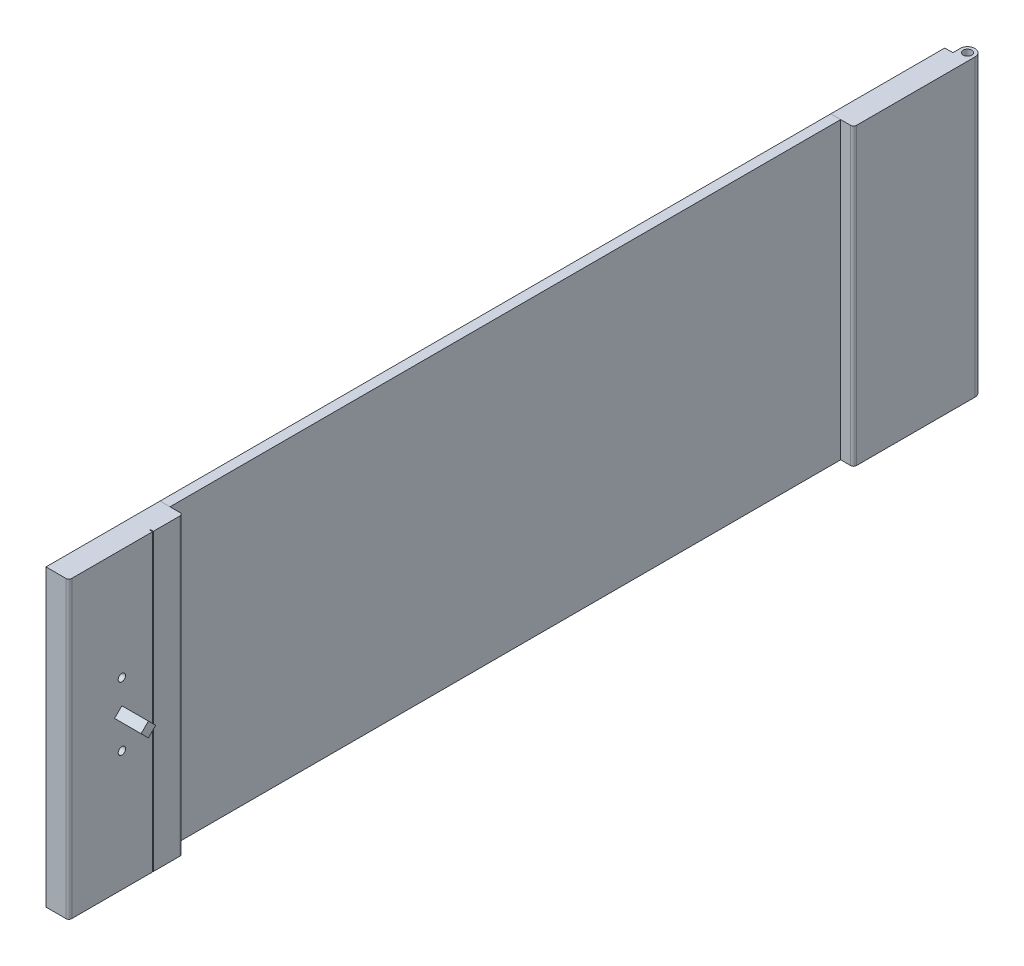
ISO-10303-21;
HEADER;
FILE_DESCRIPTION(('STEP AP214'),'2;1');
FILE_NAME('part.step','',(''),(''),'','','');
FILE_SCHEMA(('AUTOMOTIVE_DESIGN { 1 0 10303 214 1 1 1 1 }'));
ENDSEC;
DATA;
#1=APPLICATION_CONTEXT('core data for automotive mechanical design processes');
#2=APPLICATION_PROTOCOL_DEFINITION('international standard','automotive_design',2000,#1);
#3=PRODUCT_CONTEXT('',#1,'mechanical');
#4=PRODUCT('Part','Part','',(#3));
#5=PRODUCT_RELATED_PRODUCT_CATEGORY('part','',(#4));
#6=PRODUCT_DEFINITION_FORMATION('','',#4);
#7=PRODUCT_DEFINITION_CONTEXT('part definition',#1,'design');
#8=PRODUCT_DEFINITION('design','',#6,#7);
#9=PRODUCT_DEFINITION_SHAPE('','',#8);
#10=(LENGTH_UNIT() NAMED_UNIT(*) SI_UNIT(.MILLI.,.METRE.));
#11=(NAMED_UNIT(*) PLANE_ANGLE_UNIT() SI_UNIT($,.RADIAN.));
#12=(NAMED_UNIT(*) SI_UNIT($,.STERADIAN.) SOLID_ANGLE_UNIT());
#13=UNCERTAINTY_MEASURE_WITH_UNIT(LENGTH_MEASURE(1.E-05),#10,'distance_accuracy_value','');
#14=(GEOMETRIC_REPRESENTATION_CONTEXT(3) GLOBAL_UNCERTAINTY_ASSIGNED_CONTEXT((#13)) GLOBAL_UNIT_ASSIGNED_CONTEXT((#10,
#11,#12)) REPRESENTATION_CONTEXT('',''));
#15=CARTESIAN_POINT('',(0.,0.,0.));
#16=DIRECTION('',(0.,0.,1.));
#17=DIRECTION('',(1.,0.,0.));
#18=AXIS2_PLACEMENT_3D('',#15,#16,#17);
#19=CARTESIAN_POINT('',(134.032480032175,0.,346.351902973472));
#20=DIRECTION('',(-1.,0.,0.));
#21=DIRECTION('',(0.,0.,1.));
#22=AXIS2_PLACEMENT_3D('',#19,#20,#21);
#23=PLANE('',#22);
#24=DIRECTION('',(0.,0.,1.));
#25=VECTOR('',#24,1.);
#26=CARTESIAN_POINT('',(134.032480032175,200.,346.351902973472));
#27=LINE('',#26,#25);
#28=CARTESIAN_POINT('',(134.032480032175,200.,-108.848097026528));
#29=VERTEX_POINT('',#28);
#30=CARTESIAN_POINT('',(134.032480032175,200.,346.351902973472));
#31=VERTEX_POINT('',#30);
#32=EDGE_CURVE('E113',#29,#31,#27,.T.);
#33=ORIENTED_EDGE('',*,*,#32,.F.);
#34=DIRECTION('',(0.,1.,0.));
#35=VECTOR('',#34,1.);
#36=CARTESIAN_POINT('',(134.032480032175,0.,-108.848097026528));
#37=LINE('',#36,#35);
#38=CARTESIAN_POINT('',(134.032480032175,0.,-108.848097026528));
#39=VERTEX_POINT('',#38);
#40=EDGE_CURVE('E12',#39,#29,#37,.T.);
#41=ORIENTED_EDGE('',*,*,#40,.F.);
#42=DIRECTION('',(0.,0.,1.));
#43=VECTOR('',#42,1.);
#44=CARTESIAN_POINT('',(134.032480032175,0.,346.351902973472));
#45=LINE('',#44,#43);
#46=CARTESIAN_POINT('',(134.032480032175,0.,346.351902973472));
#47=VERTEX_POINT('',#46);
#48=EDGE_CURVE('E107',#39,#47,#45,.T.);
#49=ORIENTED_EDGE('',*,*,#48,.T.);
#50=DIRECTION('',(0.,1.,0.));
#51=VECTOR('',#50,1.);
#52=CARTESIAN_POINT('',(134.032480032175,0.,346.351902973472));
#53=LINE('',#52,#51);
#54=EDGE_CURVE('E52',#47,#31,#53,.T.);
#55=ORIENTED_EDGE('',*,*,#54,.T.);
#56=EDGE_LOOP('',(#33,#41,#49,#55));
#57=FACE_BOUND('',#56,.T.);
#58=ADVANCED_FACE('F49',(#57),#23,.T.);
#59=CARTESIAN_POINT('',(134.032480032175,0.,-108.848097026528));
#60=DIRECTION('',(0.,0.,-1.));
#61=DIRECTION('',(-1.,0.,0.));
#62=AXIS2_PLACEMENT_3D('',#59,#60,#61);
#63=PLANE('',#62);
#64=DIRECTION('',(-1.,0.,0.));
#65=VECTOR('',#64,1.);
#66=CARTESIAN_POINT('',(134.032480032175,200.,-108.848097026528));
#67=LINE('',#66,#65);
#68=CARTESIAN_POINT('',(140.782480032175,200.,-108.848097026528));
#69=VERTEX_POINT('',#68);
#70=EDGE_CURVE('E109',#69,#29,#67,.T.);
#71=ORIENTED_EDGE('',*,*,#70,.F.);
#72=DIRECTION('',(0.,1.,0.));
#73=VECTOR('',#72,1.);
#74=CARTESIAN_POINT('',(140.782480032175,0.,-108.848097026528));
#75=LINE('',#74,#73);
#76=CARTESIAN_POINT('',(140.782480032175,0.,-108.848097026528));
#77=VERTEX_POINT('',#76);
#78=EDGE_CURVE('E58',#77,#69,#75,.T.);
#79=ORIENTED_EDGE('',*,*,#78,.F.);
#80=DIRECTION('',(-1.,0.,0.));
#81=VECTOR('',#80,1.);
#82=CARTESIAN_POINT('',(134.032480032175,0.,-108.848097026528));
#83=LINE('',#82,#81);
#84=EDGE_CURVE('E104',#77,#39,#83,.T.);
#85=ORIENTED_EDGE('',*,*,#84,.T.);
#86=ORIENTED_EDGE('',*,*,#40,.T.);
#87=EDGE_LOOP('',(#71,#79,#85,#86));
#88=FACE_BOUND('',#87,.T.);
#89=ADVANCED_FACE('F123',(#88),#63,.T.);
#90=CARTESIAN_POINT('',(140.782480032175,0.,346.351902973472));
#91=DIRECTION('',(1.,0.,0.));
#92=DIRECTION('',(0.,0.,-1.));
#93=AXIS2_PLACEMENT_3D('',#90,#91,#92);
#94=PLANE('',#93);
#95=DIRECTION('',(0.,0.,-1.));
#96=VECTOR('',#95,1.);
#97=CARTESIAN_POINT('',(140.782480032175,200.,346.351902973472));
#98=LINE('',#97,#96);
#99=CARTESIAN_POINT('',(140.782480032175,200.,346.351902973472));
#100=VERTEX_POINT('',#99);
#101=EDGE_CURVE('E99',#100,#69,#98,.T.);
#102=ORIENTED_EDGE('',*,*,#101,.F.);
#103=DIRECTION('',(0.,1.,0.));
#104=VECTOR('',#103,1.);
#105=CARTESIAN_POINT('',(140.782480032175,0.,346.351902973472));
#106=LINE('',#105,#104);
#107=CARTESIAN_POINT('',(140.782480032175,0.,346.351902973472));
#108=VERTEX_POINT('',#107);
#109=EDGE_CURVE('E94',#108,#100,#106,.T.);
#110=ORIENTED_EDGE('',*,*,#109,.F.);
#111=DIRECTION('',(0.,0.,-1.));
#112=VECTOR('',#111,1.);
#113=CARTESIAN_POINT('',(140.782480032175,0.,346.351902973472));
#114=LINE('',#113,#112);
#115=EDGE_CURVE('E97',#108,#77,#114,.T.);
#116=ORIENTED_EDGE('',*,*,#115,.T.);
#117=ORIENTED_EDGE('',*,*,#78,.T.);
#118=EDGE_LOOP('',(#102,#110,#116,#117));
#119=FACE_BOUND('',#118,.T.);
#120=ADVANCED_FACE('F96',(#119),#94,.T.);
#121=CARTESIAN_POINT('',(134.032480032175,0.,346.351902973472));
#122=DIRECTION('',(0.,0.,1.));
#123=DIRECTION('',(1.,0.,0.));
#124=AXIS2_PLACEMENT_3D('',#121,#122,#123);
#125=PLANE('',#124);
#126=DIRECTION('',(1.,0.,0.));
#127=VECTOR('',#126,1.);
#128=CARTESIAN_POINT('',(134.032480032175,200.,346.351902973472));
#129=LINE('',#128,#127);
#130=EDGE_CURVE('E116',#31,#100,#129,.T.);
#131=ORIENTED_EDGE('',*,*,#130,.F.);
#132=ORIENTED_EDGE('',*,*,#54,.F.);
#133=DIRECTION('',(1.,0.,0.));
#134=VECTOR('',#133,1.);
#135=CARTESIAN_POINT('',(134.032480032175,0.,346.351902973472));
#136=LINE('',#135,#134);
#137=EDGE_CURVE('E103',#47,#108,#136,.T.);
#138=ORIENTED_EDGE('',*,*,#137,.T.);
#139=ORIENTED_EDGE('',*,*,#109,.T.);
#140=EDGE_LOOP('',(#131,#132,#138,#139));
#141=FACE_BOUND('',#140,.T.);
#142=ADVANCED_FACE('F106',(#141),#125,.T.);
#143=CARTESIAN_POINT('',(0.,0.,0.));
#144=DIRECTION('',(0.,-1.,0.));
#145=DIRECTION('',(0.,0.,-1.));
#146=AXIS2_PLACEMENT_3D('',#143,#144,#145);
#147=PLANE('',#146);
#148=ORIENTED_EDGE('',*,*,#48,.F.);
#149=ORIENTED_EDGE('',*,*,#84,.F.);
#150=ORIENTED_EDGE('',*,*,#115,.F.);
#151=ORIENTED_EDGE('',*,*,#137,.F.);
#152=EDGE_LOOP('',(#148,#149,#150,#151));
#153=FACE_BOUND('',#152,.T.);
#154=ADVANCED_FACE('F102',(#153),#147,.T.);
#155=CARTESIAN_POINT('',(0.,200.,0.));
#156=DIRECTION('',(0.,-1.,0.));
#157=DIRECTION('',(0.,0.,-1.));
#158=AXIS2_PLACEMENT_3D('',#155,#156,#157);
#159=PLANE('',#158);
#160=ORIENTED_EDGE('',*,*,#32,.T.);
#161=ORIENTED_EDGE('',*,*,#130,.T.);
#162=ORIENTED_EDGE('',*,*,#101,.T.);
#163=ORIENTED_EDGE('',*,*,#70,.T.);
#164=EDGE_LOOP('',(#160,#161,#162,#163));
#165=FACE_BOUND('',#164,.T.);
#166=ADVANCED_FACE('F122',(#165),#159,.F.);
#167=CLOSED_SHELL('',(#58,#89,#120,#142,#154,#166));
#168=MANIFOLD_SOLID_BREP('B2',#167);
#169=CARTESIAN_POINT('',(144.532480032175,200.,-191.248097026528));
#170=DIRECTION('',(0.,1.,0.));
#171=DIRECTION('',(0.,0.,1.));
#172=AXIS2_PLACEMENT_3D('',#169,#170,#171);
#173=PLANE('',#172);
#174=DIRECTION('',(0.,0.,1.));
#175=VECTOR('',#174,1.);
#176=CARTESIAN_POINT('',(134.032480032175,200.,-108.848097026528));
#177=LINE('',#176,#175);
#178=CARTESIAN_POINT('',(134.032480032175,200.,-186.248097026528));
#179=VERTEX_POINT('',#178);
#180=CARTESIAN_POINT('',(134.032480032175,200.,-108.848097026528));
#181=VERTEX_POINT('',#180);
#182=EDGE_CURVE('E286',#179,#181,#177,.T.);
#183=ORIENTED_EDGE('',*,*,#182,.T.);
#184=DIRECTION('',(1.,0.,0.));
#185=VECTOR('',#184,1.);
#186=CARTESIAN_POINT('',(134.032480032175,200.,-108.848097026528));
#187=LINE('',#186,#185);
#188=CARTESIAN_POINT('',(147.532480032175,200.,-108.848097026528));
#189=VERTEX_POINT('',#188);
#190=EDGE_CURVE('E238',#181,#189,#187,.T.);
#191=ORIENTED_EDGE('',*,*,#190,.T.);
#192=CARTESIAN_POINT('',(147.532480032175,200.,-110.848097026528));
#193=DIRECTION('',(0.,1.,0.));
#194=DIRECTION('',(0.,0.,1.));
#195=AXIS2_PLACEMENT_3D('',#192,#193,#194);
#196=CIRCLE('',#195,2.);
#197=CARTESIAN_POINT('',(149.532480032175,200.,-110.848097026528));
#198=VERTEX_POINT('',#197);
#199=EDGE_CURVE('E298',#189,#198,#196,.T.);
#200=ORIENTED_EDGE('',*,*,#199,.T.);
#201=DIRECTION('',(0.,0.,-1.));
#202=VECTOR('',#201,1.);
#203=CARTESIAN_POINT('',(149.532480032175,200.,-110.848097026528));
#204=LINE('',#203,#202);
#205=CARTESIAN_POINT('',(149.532480032175,200.,-191.248097026528));
#206=VERTEX_POINT('',#205);
#207=EDGE_CURVE('E254',#198,#206,#204,.T.);
#208=ORIENTED_EDGE('',*,*,#207,.T.);
#209=CARTESIAN_POINT('',(144.532480032175,200.,-191.248097026528));
#210=DIRECTION('',(0.,1.,0.));
#211=DIRECTION('',(0.,0.,1.));
#212=AXIS2_PLACEMENT_3D('',#209,#210,#211);
#213=CIRCLE('',#212,5.00000000000003);
#214=CARTESIAN_POINT('',(139.532480032175,200.,-191.248097026528));
#215=VERTEX_POINT('',#214);
#216=EDGE_CURVE('E248',#206,#215,#213,.T.);
#217=ORIENTED_EDGE('',*,*,#216,.T.);
#218=DIRECTION('',(0.,0.,1.));
#219=VECTOR('',#218,1.);
#220=CARTESIAN_POINT('',(139.532480032175,200.,-191.248097026528));
#221=LINE('',#220,#219);
#222=CARTESIAN_POINT('',(139.532480032175,200.,-186.248097026528));
#223=VERTEX_POINT('',#222);
#224=EDGE_CURVE('E252',#215,#223,#221,.T.);
#225=ORIENTED_EDGE('',*,*,#224,.T.);
#226=DIRECTION('',(-1.,0.,0.));
#227=VECTOR('',#226,1.);
#228=CARTESIAN_POINT('',(134.032480032175,200.,-186.248097026528));
#229=LINE('',#228,#227);
#230=EDGE_CURVE('E198',#223,#179,#229,.T.);
#231=ORIENTED_EDGE('',*,*,#230,.T.);
#232=EDGE_LOOP('',(#183,#191,#200,#208,#217,#225,#231));
#233=FACE_BOUND('',#232,.T.);
#234=CARTESIAN_POINT('',(144.532480032175,200.,-191.248097026528));
#235=DIRECTION('',(0.,1.,0.));
#236=DIRECTION('',(0.,0.,1.));
#237=AXIS2_PLACEMENT_3D('',#234,#235,#236);
#238=CIRCLE('',#237,2.93194055291801);
#239=CARTESIAN_POINT('',(144.532480032175,200.,-188.31615647361));
#240=VERTEX_POINT('',#239);
#241=EDGE_CURVE('E276',#240,#240,#238,.T.);
#242=ORIENTED_EDGE('',*,*,#241,.F.);
#243=EDGE_LOOP('',(#242));
#244=FACE_BOUND('',#243,.T.);
#245=ADVANCED_FACE('F181',(#233,#244),#173,.T.);
#246=CARTESIAN_POINT('',(144.532480032175,0.,-191.248097026528));
#247=DIRECTION('',(0.,1.,0.));
#248=DIRECTION('',(0.,0.,1.));
#249=AXIS2_PLACEMENT_3D('',#246,#247,#248);
#250=PLANE('',#249);
#251=DIRECTION('',(0.,0.,1.));
#252=VECTOR('',#251,1.);
#253=CARTESIAN_POINT('',(134.032480032175,0.,-108.848097026528));
#254=LINE('',#253,#252);
#255=CARTESIAN_POINT('',(134.032480032175,0.,-186.248097026528));
#256=VERTEX_POINT('',#255);
#257=CARTESIAN_POINT('',(134.032480032175,0.,-108.848097026528));
#258=VERTEX_POINT('',#257);
#259=EDGE_CURVE('E272',#256,#258,#254,.T.);
#260=ORIENTED_EDGE('',*,*,#259,.F.);
#261=DIRECTION('',(-1.,0.,0.));
#262=VECTOR('',#261,1.);
#263=CARTESIAN_POINT('',(134.032480032175,0.,-186.248097026528));
#264=LINE('',#263,#262);
#265=CARTESIAN_POINT('',(139.532480032175,0.,-186.248097026528));
#266=VERTEX_POINT('',#265);
#267=EDGE_CURVE('E230',#266,#256,#264,.T.);
#268=ORIENTED_EDGE('',*,*,#267,.F.);
#269=DIRECTION('',(0.,0.,1.));
#270=VECTOR('',#269,1.);
#271=CARTESIAN_POINT('',(139.532480032175,0.,-191.248097026528));
#272=LINE('',#271,#270);
#273=CARTESIAN_POINT('',(139.532480032175,0.,-191.248097026528));
#274=VERTEX_POINT('',#273);
#275=EDGE_CURVE('E224',#274,#266,#272,.T.);
#276=ORIENTED_EDGE('',*,*,#275,.F.);
#277=CARTESIAN_POINT('',(144.532480032175,0.,-191.248097026528));
#278=DIRECTION('',(0.,1.,0.));
#279=DIRECTION('',(0.,0.,1.));
#280=AXIS2_PLACEMENT_3D('',#277,#278,#279);
#281=CIRCLE('',#280,5.00000000000003);
#282=CARTESIAN_POINT('',(149.532480032175,0.,-191.248097026528));
#283=VERTEX_POINT('',#282);
#284=EDGE_CURVE('E262',#283,#274,#281,.T.);
#285=ORIENTED_EDGE('',*,*,#284,.F.);
#286=DIRECTION('',(0.,0.,-1.));
#287=VECTOR('',#286,1.);
#288=CARTESIAN_POINT('',(149.532480032175,0.,-191.248097026528));
#289=LINE('',#288,#287);
#290=CARTESIAN_POINT('',(149.532480032175,0.,-110.848097026528));
#291=VERTEX_POINT('',#290);
#292=EDGE_CURVE('E281',#291,#283,#289,.T.);
#293=ORIENTED_EDGE('',*,*,#292,.F.);
#294=CARTESIAN_POINT('',(147.532480032175,0.,-110.848097026528));
#295=DIRECTION('',(0.,1.,0.));
#296=DIRECTION('',(0.,0.,1.));
#297=AXIS2_PLACEMENT_3D('',#294,#295,#296);
#298=CIRCLE('',#297,2.);
#299=CARTESIAN_POINT('',(147.532480032175,0.,-108.848097026528));
#300=VERTEX_POINT('',#299);
#301=EDGE_CURVE('E278',#300,#291,#298,.T.);
#302=ORIENTED_EDGE('',*,*,#301,.F.);
#303=DIRECTION('',(1.,0.,0.));
#304=VECTOR('',#303,1.);
#305=CARTESIAN_POINT('',(134.032480032175,0.,-108.848097026528));
#306=LINE('',#305,#304);
#307=EDGE_CURVE('E275',#258,#300,#306,.T.);
#308=ORIENTED_EDGE('',*,*,#307,.F.);
#309=EDGE_LOOP('',(#260,#268,#276,#285,#293,#302,#308));
#310=FACE_BOUND('',#309,.T.);
#311=CARTESIAN_POINT('',(144.532480032175,0.,-191.248097026528));
#312=DIRECTION('',(0.,1.,0.));
#313=DIRECTION('',(0.,0.,1.));
#314=AXIS2_PLACEMENT_3D('',#311,#312,#313);
#315=CIRCLE('',#314,2.93194055291801);
#316=CARTESIAN_POINT('',(144.532480032175,0.,-188.31615647361));
#317=VERTEX_POINT('',#316);
#318=EDGE_CURVE('E309',#317,#317,#315,.T.);
#319=ORIENTED_EDGE('',*,*,#318,.T.);
#320=EDGE_LOOP('',(#319));
#321=FACE_BOUND('',#320,.T.);
#322=ADVANCED_FACE('F301',(#310,#321),#250,.F.);
#323=CARTESIAN_POINT('',(134.032480032175,200.,-108.848097026528));
#324=DIRECTION('',(1.,0.,0.));
#325=DIRECTION('',(0.,0.,-1.));
#326=AXIS2_PLACEMENT_3D('',#323,#324,#325);
#327=PLANE('',#326);
#328=ORIENTED_EDGE('',*,*,#259,.T.);
#329=DIRECTION('',(0.,-1.,0.));
#330=VECTOR('',#329,1.);
#331=CARTESIAN_POINT('',(134.032480032175,200.,-108.848097026528));
#332=LINE('',#331,#330);
#333=EDGE_CURVE('E47',#181,#258,#332,.T.);
#334=ORIENTED_EDGE('',*,*,#333,.F.);
#335=ORIENTED_EDGE('',*,*,#182,.F.);
#336=DIRECTION('',(0.,-1.,0.));
#337=VECTOR('',#336,1.);
#338=CARTESIAN_POINT('',(134.032480032175,200.,-186.248097026528));
#339=LINE('',#338,#337);
#340=EDGE_CURVE('E268',#179,#256,#339,.T.);
#341=ORIENTED_EDGE('',*,*,#340,.T.);
#342=EDGE_LOOP('',(#328,#334,#335,#341));
#343=FACE_BOUND('',#342,.T.);
#344=ADVANCED_FACE('F183',(#343),#327,.F.);
#345=CARTESIAN_POINT('',(134.032480032175,200.,-108.848097026528));
#346=DIRECTION('',(0.,0.,-1.));
#347=DIRECTION('',(-1.,0.,0.));
#348=AXIS2_PLACEMENT_3D('',#345,#346,#347);
#349=PLANE('',#348);
#350=ORIENTED_EDGE('',*,*,#307,.T.);
#351=DIRECTION('',(0.,-1.,0.));
#352=VECTOR('',#351,1.);
#353=CARTESIAN_POINT('',(147.532480032175,200.,-108.848097026528));
#354=LINE('',#353,#352);
#355=EDGE_CURVE('E190',#189,#300,#354,.T.);
#356=ORIENTED_EDGE('',*,*,#355,.F.);
#357=ORIENTED_EDGE('',*,*,#190,.F.);
#358=ORIENTED_EDGE('',*,*,#333,.T.);
#359=EDGE_LOOP('',(#350,#356,#357,#358));
#360=FACE_BOUND('',#359,.T.);
#361=ADVANCED_FACE('F335',(#360),#349,.F.);
#362=CARTESIAN_POINT('',(147.532480032175,200.,-110.848097026528));
#363=DIRECTION('',(0.,-1.,0.));
#364=DIRECTION('',(0.,0.,-1.));
#365=AXIS2_PLACEMENT_3D('',#362,#363,#364);
#366=CYLINDRICAL_SURFACE('',#365,2.);
#367=ORIENTED_EDGE('',*,*,#301,.T.);
#368=DIRECTION('',(0.,-1.,0.));
#369=VECTOR('',#368,1.);
#370=CARTESIAN_POINT('',(149.532480032175,200.,-110.848097026528));
#371=LINE('',#370,#369);
#372=EDGE_CURVE('E290',#198,#291,#371,.T.);
#373=ORIENTED_EDGE('',*,*,#372,.F.);
#374=ORIENTED_EDGE('',*,*,#199,.F.);
#375=ORIENTED_EDGE('',*,*,#355,.T.);
#376=EDGE_LOOP('',(#367,#373,#374,#375));
#377=FACE_BOUND('',#376,.T.);
#378=ADVANCED_FACE('F296',(#377),#366,.T.);
#379=CARTESIAN_POINT('',(149.532480032175,200.,-191.248097026528));
#380=DIRECTION('',(-1.,0.,0.));
#381=DIRECTION('',(0.,0.,1.));
#382=AXIS2_PLACEMENT_3D('',#379,#380,#381);
#383=PLANE('',#382);
#384=ORIENTED_EDGE('',*,*,#292,.T.);
#385=DIRECTION('',(0.,-1.,0.));
#386=VECTOR('',#385,1.);
#387=CARTESIAN_POINT('',(149.532480032175,200.,-191.248097026528));
#388=LINE('',#387,#386);
#389=EDGE_CURVE('E263',#206,#283,#388,.T.);
#390=ORIENTED_EDGE('',*,*,#389,.F.);
#391=ORIENTED_EDGE('',*,*,#207,.F.);
#392=ORIENTED_EDGE('',*,*,#372,.T.);
#393=EDGE_LOOP('',(#384,#390,#391,#392));
#394=FACE_BOUND('',#393,.T.);
#395=ADVANCED_FACE('F304',(#394),#383,.F.);
#396=CARTESIAN_POINT('',(144.532480032175,200.,-191.248097026528));
#397=DIRECTION('',(0.,-1.,0.));
#398=DIRECTION('',(0.,0.,-1.));
#399=AXIS2_PLACEMENT_3D('',#396,#397,#398);
#400=CYLINDRICAL_SURFACE('',#399,5.00000000000003);
#401=ORIENTED_EDGE('',*,*,#284,.T.);
#402=DIRECTION('',(0.,-1.,0.));
#403=VECTOR('',#402,1.);
#404=CARTESIAN_POINT('',(139.532480032175,200.,-191.248097026528));
#405=LINE('',#404,#403);
#406=EDGE_CURVE('E259',#215,#274,#405,.T.);
#407=ORIENTED_EDGE('',*,*,#406,.F.);
#408=ORIENTED_EDGE('',*,*,#216,.F.);
#409=ORIENTED_EDGE('',*,*,#389,.T.);
#410=EDGE_LOOP('',(#401,#407,#408,#409));
#411=FACE_BOUND('',#410,.T.);
#412=ADVANCED_FACE('F260',(#411),#400,.T.);
#413=CARTESIAN_POINT('',(139.532480032175,200.,-191.248097026528));
#414=DIRECTION('',(1.,0.,0.));
#415=DIRECTION('',(0.,0.,-1.));
#416=AXIS2_PLACEMENT_3D('',#413,#414,#415);
#417=PLANE('',#416);
#418=ORIENTED_EDGE('',*,*,#275,.T.);
#419=DIRECTION('',(0.,-1.,0.));
#420=VECTOR('',#419,1.);
#421=CARTESIAN_POINT('',(139.532480032175,200.,-186.248097026528));
#422=LINE('',#421,#420);
#423=EDGE_CURVE('E264',#223,#266,#422,.T.);
#424=ORIENTED_EDGE('',*,*,#423,.F.);
#425=ORIENTED_EDGE('',*,*,#224,.F.);
#426=ORIENTED_EDGE('',*,*,#406,.T.);
#427=EDGE_LOOP('',(#418,#424,#425,#426));
#428=FACE_BOUND('',#427,.T.);
#429=ADVANCED_FACE('F266',(#428),#417,.F.);
#430=CARTESIAN_POINT('',(134.032480032175,200.,-186.248097026528));
#431=DIRECTION('',(0.,0.,1.));
#432=DIRECTION('',(1.,0.,0.));
#433=AXIS2_PLACEMENT_3D('',#430,#431,#432);
#434=PLANE('',#433);
#435=ORIENTED_EDGE('',*,*,#267,.T.);
#436=ORIENTED_EDGE('',*,*,#340,.F.);
#437=ORIENTED_EDGE('',*,*,#230,.F.);
#438=ORIENTED_EDGE('',*,*,#423,.T.);
#439=EDGE_LOOP('',(#435,#436,#437,#438));
#440=FACE_BOUND('',#439,.T.);
#441=ADVANCED_FACE('F325',(#440),#434,.F.);
#442=CARTESIAN_POINT('',(144.532480032175,200.,-191.248097026528));
#443=DIRECTION('',(0.,-1.,0.));
#444=DIRECTION('',(0.,0.,-1.));
#445=AXIS2_PLACEMENT_3D('',#442,#443,#444);
#446=CYLINDRICAL_SURFACE('',#445,2.93194055291801);
#447=ORIENTED_EDGE('',*,*,#241,.T.);
#448=EDGE_LOOP('',(#447));
#449=FACE_BOUND('',#448,.T.);
#450=ORIENTED_EDGE('',*,*,#318,.F.);
#451=EDGE_LOOP('',(#450));
#452=FACE_BOUND('',#451,.T.);
#453=ADVANCED_FACE('F315',(#449,#452),#446,.F.);
#454=CLOSED_SHELL('',(#245,#322,#344,#361,#378,#395,#412,#429,#441,#453));
#455=MANIFOLD_SOLID_BREP('B6',#454);
#456=CARTESIAN_POINT('',(149.532480032175,200.,421.751902973472));
#457=DIRECTION('',(-1.,0.,0.));
#458=DIRECTION('',(0.,0.,1.));
#459=AXIS2_PLACEMENT_3D('',#456,#457,#458);
#460=PLANE('',#459);
#461=DIRECTION('',(0.,0.,-1.));
#462=VECTOR('',#461,1.);
#463=CARTESIAN_POINT('',(149.532480032175,0.,421.751902973472));
#464=LINE('',#463,#462);
#465=CARTESIAN_POINT('',(149.532480032175,0.,421.751902973472));
#466=VERTEX_POINT('',#465);
#467=CARTESIAN_POINT('',(149.532480032175,0.,366.951902973472));
#468=VERTEX_POINT('',#467);
#469=EDGE_CURVE('E576',#466,#468,#464,.T.);
#470=ORIENTED_EDGE('',*,*,#469,.T.);
#471=DIRECTION('',(0.,-1.,0.));
#472=VECTOR('',#471,1.);
#473=CARTESIAN_POINT('',(149.532480032175,200.,366.951902973472));
#474=LINE('',#473,#472);
#475=CARTESIAN_POINT('',(149.532480032175,200.,366.951902973472));
#476=VERTEX_POINT('',#475);
#477=EDGE_CURVE('E606',#476,#468,#474,.T.);
#478=ORIENTED_EDGE('',*,*,#477,.F.);
#479=DIRECTION('',(0.,0.,-1.));
#480=VECTOR('',#479,1.);
#481=CARTESIAN_POINT('',(149.532480032175,200.,421.751902973472));
#482=LINE('',#481,#480);
#483=CARTESIAN_POINT('',(149.532480032175,200.,421.751902973472));
#484=VERTEX_POINT('',#483);
#485=EDGE_CURVE('E555',#484,#476,#482,.T.);
#486=ORIENTED_EDGE('',*,*,#485,.F.);
#487=DIRECTION('',(0.,-1.,0.));
#488=VECTOR('',#487,1.);
#489=CARTESIAN_POINT('',(149.532480032175,200.,421.751902973472));
#490=LINE('',#489,#488);
#491=EDGE_CURVE('E609',#484,#466,#490,.T.);
#492=ORIENTED_EDGE('',*,*,#491,.T.);
#493=EDGE_LOOP('',(#470,#478,#486,#492));
#494=FACE_BOUND('',#493,.T.);
#495=DIRECTION('',(0.,0.707106781186548,-0.707106781186548));
#496=VECTOR('',#495,1.);
#497=CARTESIAN_POINT('',(149.532480032175,247.937135064061,247.937135064061));
#498=LINE('',#497,#496);
#499=CARTESIAN_POINT('',(149.532480032175,103.172619686343,392.701650441778));
#500=VERTEX_POINT('',#499);
#501=CARTESIAN_POINT('',(149.532480032175,108.122367154649,387.751902973472));
#502=VERTEX_POINT('',#501);
#503=EDGE_CURVE('E422',#500,#502,#498,.T.);
#504=ORIENTED_EDGE('',*,*,#503,.T.);
#505=DIRECTION('',(0.,-0.707106781186546,-0.70710678118655));
#506=VECTOR('',#505,1.);
#507=CARTESIAN_POINT('',(149.532480032175,-139.814767909411,139.81476790941));
#508=LINE('',#507,#506);
#509=CARTESIAN_POINT('',(149.532480032175,103.172619686344,382.802155505166));
#510=VERTEX_POINT('',#509);
#511=EDGE_CURVE('E512',#502,#510,#508,.T.);
#512=ORIENTED_EDGE('',*,*,#511,.T.);
#513=DIRECTION('',(0.,0.707106781186548,-0.707106781186548));
#514=VECTOR('',#513,1.);
#515=CARTESIAN_POINT('',(149.532480032175,242.987387595755,242.987387595755));
#516=LINE('',#515,#514);
#517=CARTESIAN_POINT('',(149.532480032175,98.2228722180377,387.751902973472));
#518=VERTEX_POINT('',#517);
#519=EDGE_CURVE('E525',#518,#510,#516,.T.);
#520=ORIENTED_EDGE('',*,*,#519,.F.);
#521=DIRECTION('',(0.,-0.707106781186546,-0.70710678118655));
#522=VECTOR('',#521,1.);
#523=CARTESIAN_POINT('',(149.532480032175,-144.764515377717,144.764515377716));
#524=LINE('',#523,#522);
#525=EDGE_CURVE('E427',#500,#518,#524,.T.);
#526=ORIENTED_EDGE('',*,*,#525,.F.);
#527=EDGE_LOOP('',(#504,#512,#520,#526));
#528=FACE_BOUND('',#527,.T.);
#529=CARTESIAN_POINT('',(149.532480032175,81.6726196863435,387.751902973472));
#530=DIRECTION('',(1.,0.,0.));
#531=DIRECTION('',(0.,0.,-1.));
#532=AXIS2_PLACEMENT_3D('',#529,#530,#531);
#533=CIRCLE('',#532,2.50000000000002);
#534=CARTESIAN_POINT('',(149.532480032175,81.6726196863435,385.251902973472));
#535=VERTEX_POINT('',#534);
#536=EDGE_CURVE('E841',#535,#535,#533,.F.);
#537=ORIENTED_EDGE('',*,*,#536,.T.);
#538=EDGE_LOOP('',(#537));
#539=FACE_BOUND('',#538,.T.);
#540=CARTESIAN_POINT('',(149.532480032175,124.672619686344,387.751902973472));
#541=DIRECTION('',(1.,0.,0.));
#542=DIRECTION('',(0.,0.,-1.));
#543=AXIS2_PLACEMENT_3D('',#540,#541,#542);
#544=CIRCLE('',#543,2.50000000000002);
#545=CARTESIAN_POINT('',(149.532480032175,124.672619686344,385.251902973472));
#546=VERTEX_POINT('',#545);
#547=EDGE_CURVE('E834',#546,#546,#544,.T.);
#548=ORIENTED_EDGE('',*,*,#547,.F.);
#549=EDGE_LOOP('',(#548));
#550=FACE_BOUND('',#549,.T.);
#551=ADVANCED_FACE('F407',(#494,#528,#539,#550),#460,.F.);
#552=CARTESIAN_POINT('',(134.032480032175,200.,423.751902973472));
#553=DIRECTION('',(1.,0.,0.));
#554=DIRECTION('',(0.,0.,-1.));
#555=AXIS2_PLACEMENT_3D('',#552,#553,#554);
#556=PLANE('',#555);
#557=DIRECTION('',(0.,0.,1.));
#558=VECTOR('',#557,1.);
#559=CARTESIAN_POINT('',(134.032480032175,0.,423.751902973472));
#560=LINE('',#559,#558);
#561=CARTESIAN_POINT('',(134.032480032175,0.,346.351902973472));
#562=VERTEX_POINT('',#561);
#563=CARTESIAN_POINT('',(134.032480032175,0.,423.751902973472));
#564=VERTEX_POINT('',#563);
#565=EDGE_CURVE('E515',#562,#564,#560,.T.);
#566=ORIENTED_EDGE('',*,*,#565,.T.);
#567=DIRECTION('',(0.,-1.,0.));
#568=VECTOR('',#567,1.);
#569=CARTESIAN_POINT('',(134.032480032175,200.,423.751902973472));
#570=LINE('',#569,#568);
#571=CARTESIAN_POINT('',(134.032480032175,200.,423.751902973472));
#572=VERTEX_POINT('',#571);
#573=EDGE_CURVE('E179',#572,#564,#570,.T.);
#574=ORIENTED_EDGE('',*,*,#573,.F.);
#575=DIRECTION('',(0.,0.,1.));
#576=VECTOR('',#575,1.);
#577=CARTESIAN_POINT('',(134.032480032175,200.,423.751902973472));
#578=LINE('',#577,#576);
#579=CARTESIAN_POINT('',(134.032480032175,200.,346.351902973472));
#580=VERTEX_POINT('',#579);
#581=EDGE_CURVE('E547',#580,#572,#578,.T.);
#582=ORIENTED_EDGE('',*,*,#581,.F.);
#583=DIRECTION('',(0.,-1.,0.));
#584=VECTOR('',#583,1.);
#585=CARTESIAN_POINT('',(134.032480032175,200.,346.351902973472));
#586=LINE('',#585,#584);
#587=EDGE_CURVE('E569',#580,#562,#586,.T.);
#588=ORIENTED_EDGE('',*,*,#587,.T.);
#589=EDGE_LOOP('',(#566,#574,#582,#588));
#590=FACE_BOUND('',#589,.T.);
#591=ADVANCED_FACE('F409',(#590),#556,.F.);
#592=CARTESIAN_POINT('',(134.032480032175,200.,423.751902973472));
#593=DIRECTION('',(0.,0.,-1.));
#594=DIRECTION('',(-1.,0.,0.));
#595=AXIS2_PLACEMENT_3D('',#592,#593,#594);
#596=PLANE('',#595);
#597=DIRECTION('',(1.,0.,0.));
#598=VECTOR('',#597,1.);
#599=CARTESIAN_POINT('',(134.032480032175,0.,423.751902973472));
#600=LINE('',#599,#598);
#601=CARTESIAN_POINT('',(147.532480032175,0.,423.751902973472));
#602=VERTEX_POINT('',#601);
#603=EDGE_CURVE('E572',#564,#602,#600,.T.);
#604=ORIENTED_EDGE('',*,*,#603,.T.);
#605=DIRECTION('',(0.,-1.,0.));
#606=VECTOR('',#605,1.);
#607=CARTESIAN_POINT('',(147.532480032175,200.,423.751902973472));
#608=LINE('',#607,#606);
#609=CARTESIAN_POINT('',(147.532480032175,200.,423.751902973472));
#610=VERTEX_POINT('',#609);
#611=EDGE_CURVE('E415',#610,#602,#608,.T.);
#612=ORIENTED_EDGE('',*,*,#611,.F.);
#613=DIRECTION('',(1.,0.,0.));
#614=VECTOR('',#613,1.);
#615=CARTESIAN_POINT('',(134.032480032175,200.,423.751902973472));
#616=LINE('',#615,#614);
#617=EDGE_CURVE('E550',#572,#610,#616,.T.);
#618=ORIENTED_EDGE('',*,*,#617,.F.);
#619=ORIENTED_EDGE('',*,*,#573,.T.);
#620=EDGE_LOOP('',(#604,#612,#618,#619));
#621=FACE_BOUND('',#620,.T.);
#622=ADVANCED_FACE('F638',(#621),#596,.F.);
#623=CARTESIAN_POINT('',(147.532480032175,200.,421.751902973472));
#624=DIRECTION('',(0.,-1.,0.));
#625=DIRECTION('',(0.,0.,-1.));
#626=AXIS2_PLACEMENT_3D('',#623,#624,#625);
#627=CYLINDRICAL_SURFACE('',#626,2.);
#628=CARTESIAN_POINT('',(147.532480032175,0.,421.751902973472));
#629=DIRECTION('',(0.,1.,0.));
#630=DIRECTION('',(0.,0.,1.));
#631=AXIS2_PLACEMENT_3D('',#628,#629,#630);
#632=CIRCLE('',#631,2.);
#633=EDGE_CURVE('E574',#602,#466,#632,.T.);
#634=ORIENTED_EDGE('',*,*,#633,.T.);
#635=ORIENTED_EDGE('',*,*,#491,.F.);
#636=CARTESIAN_POINT('',(147.532480032175,200.,421.751902973472));
#637=DIRECTION('',(0.,1.,0.));
#638=DIRECTION('',(0.,0.,1.));
#639=AXIS2_PLACEMENT_3D('',#636,#637,#638);
#640=CIRCLE('',#639,2.);
#641=EDGE_CURVE('E553',#610,#484,#640,.T.);
#642=ORIENTED_EDGE('',*,*,#641,.F.);
#643=ORIENTED_EDGE('',*,*,#611,.T.);
#644=EDGE_LOOP('',(#634,#635,#642,#643));
#645=FACE_BOUND('',#644,.T.);
#646=ADVANCED_FACE('F616',(#645),#627,.T.);
#647=CARTESIAN_POINT('',(149.532480032175,200.,366.951902973472));
#648=DIRECTION('',(0.,0.,1.));
#649=DIRECTION('',(1.,0.,0.));
#650=AXIS2_PLACEMENT_3D('',#647,#648,#649);
#651=PLANE('',#650);
#652=DIRECTION('',(-1.,0.,0.));
#653=VECTOR('',#652,1.);
#654=CARTESIAN_POINT('',(149.532480032175,0.,366.951902973472));
#655=LINE('',#654,#653);
#656=CARTESIAN_POINT('',(147.532480032175,0.,366.951902973472));
#657=VERTEX_POINT('',#656);
#658=EDGE_CURVE('E578',#468,#657,#655,.T.);
#659=ORIENTED_EDGE('',*,*,#658,.T.);
#660=DIRECTION('',(0.,-1.,0.));
#661=VECTOR('',#660,1.);
#662=CARTESIAN_POINT('',(147.532480032175,200.,366.951902973472));
#663=LINE('',#662,#661);
#664=CARTESIAN_POINT('',(147.532480032175,200.,366.951902973472));
#665=VERTEX_POINT('',#664);
#666=EDGE_CURVE('E603',#665,#657,#663,.T.);
#667=ORIENTED_EDGE('',*,*,#666,.F.);
#668=DIRECTION('',(-1.,0.,0.));
#669=VECTOR('',#668,1.);
#670=CARTESIAN_POINT('',(149.532480032175,200.,366.951902973472));
#671=LINE('',#670,#669);
#672=EDGE_CURVE('E557',#476,#665,#671,.T.);
#673=ORIENTED_EDGE('',*,*,#672,.F.);
#674=ORIENTED_EDGE('',*,*,#477,.T.);
#675=EDGE_LOOP('',(#659,#667,#673,#674));
#676=FACE_BOUND('',#675,.T.);
#677=ADVANCED_FACE('F630',(#676),#651,.F.);
#678=CARTESIAN_POINT('',(147.532480032175,200.,366.451902973472));
#679=DIRECTION('',(-1.,0.,0.));
#680=DIRECTION('',(0.,0.,1.));
#681=AXIS2_PLACEMENT_3D('',#678,#679,#680);
#682=PLANE('',#681);
#683=DIRECTION('',(0.,0.,-1.));
#684=VECTOR('',#683,1.);
#685=CARTESIAN_POINT('',(147.532480032175,0.,366.451902973472));
#686=LINE('',#685,#684);
#687=CARTESIAN_POINT('',(147.532480032175,0.,366.451902973472));
#688=VERTEX_POINT('',#687);
#689=EDGE_CURVE('E580',#657,#688,#686,.T.);
#690=ORIENTED_EDGE('',*,*,#689,.T.);
#691=DIRECTION('',(0.,-1.,0.));
#692=VECTOR('',#691,1.);
#693=CARTESIAN_POINT('',(147.532480032175,200.,366.451902973472));
#694=LINE('',#693,#692);
#695=CARTESIAN_POINT('',(147.532480032175,200.,366.451902973472));
#696=VERTEX_POINT('',#695);
#697=EDGE_CURVE('E600',#696,#688,#694,.T.);
#698=ORIENTED_EDGE('',*,*,#697,.F.);
#699=DIRECTION('',(0.,0.,-1.));
#700=VECTOR('',#699,1.);
#701=CARTESIAN_POINT('',(147.532480032175,200.,366.451902973472));
#702=LINE('',#701,#700);
#703=EDGE_CURVE('E559',#665,#696,#702,.T.);
#704=ORIENTED_EDGE('',*,*,#703,.F.);
#705=ORIENTED_EDGE('',*,*,#666,.T.);
#706=EDGE_LOOP('',(#690,#698,#704,#705));
#707=FACE_BOUND('',#706,.T.);
#708=ADVANCED_FACE('F661',(#707),#682,.F.);
#709=CARTESIAN_POINT('',(149.532480032175,200.,366.451902973472));
#710=DIRECTION('',(0.,0.,-1.));
#711=DIRECTION('',(-1.,0.,0.));
#712=AXIS2_PLACEMENT_3D('',#709,#710,#711);
#713=PLANE('',#712);
#714=DIRECTION('',(1.,0.,0.));
#715=VECTOR('',#714,1.);
#716=CARTESIAN_POINT('',(149.532480032175,0.,366.451902973472));
#717=LINE('',#716,#715);
#718=CARTESIAN_POINT('',(149.532480032175,0.,366.451902973472));
#719=VERTEX_POINT('',#718);
#720=EDGE_CURVE('E582',#688,#719,#717,.T.);
#721=ORIENTED_EDGE('',*,*,#720,.T.);
#722=DIRECTION('',(0.,-1.,0.));
#723=VECTOR('',#722,1.);
#724=CARTESIAN_POINT('',(149.532480032175,200.,366.451902973472));
#725=LINE('',#724,#723);
#726=CARTESIAN_POINT('',(149.532480032175,200.,366.451902973472));
#727=VERTEX_POINT('',#726);
#728=EDGE_CURVE('E597',#727,#719,#725,.T.);
#729=ORIENTED_EDGE('',*,*,#728,.F.);
#730=DIRECTION('',(1.,0.,0.));
#731=VECTOR('',#730,1.);
#732=CARTESIAN_POINT('',(149.532480032175,200.,366.451902973472));
#733=LINE('',#732,#731);
#734=EDGE_CURVE('E561',#696,#727,#733,.T.);
#735=ORIENTED_EDGE('',*,*,#734,.F.);
#736=ORIENTED_EDGE('',*,*,#697,.T.);
#737=EDGE_LOOP('',(#721,#729,#735,#736));
#738=FACE_BOUND('',#737,.T.);
#739=ADVANCED_FACE('F658',(#738),#713,.F.);
#740=CARTESIAN_POINT('',(149.532480032175,200.,366.451902973472));
#741=DIRECTION('',(-1.,0.,0.));
#742=DIRECTION('',(0.,0.,1.));
#743=AXIS2_PLACEMENT_3D('',#740,#741,#742);
#744=PLANE('',#743);
#745=DIRECTION('',(0.,0.,-1.));
#746=VECTOR('',#745,1.);
#747=CARTESIAN_POINT('',(149.532480032175,0.,366.451902973472));
#748=LINE('',#747,#746);
#749=CARTESIAN_POINT('',(149.532480032175,0.,348.351902973472));
#750=VERTEX_POINT('',#749);
#751=EDGE_CURVE('E584',#719,#750,#748,.T.);
#752=ORIENTED_EDGE('',*,*,#751,.T.);
#753=DIRECTION('',(0.,-1.,0.));
#754=VECTOR('',#753,1.);
#755=CARTESIAN_POINT('',(149.532480032175,200.,348.351902973472));
#756=LINE('',#755,#754);
#757=CARTESIAN_POINT('',(149.532480032175,200.,348.351902973472));
#758=VERTEX_POINT('',#757);
#759=EDGE_CURVE('E594',#758,#750,#756,.T.);
#760=ORIENTED_EDGE('',*,*,#759,.F.);
#761=DIRECTION('',(0.,0.,-1.));
#762=VECTOR('',#761,1.);
#763=CARTESIAN_POINT('',(149.532480032175,200.,366.451902973472));
#764=LINE('',#763,#762);
#765=EDGE_CURVE('E563',#727,#758,#764,.T.);
#766=ORIENTED_EDGE('',*,*,#765,.F.);
#767=ORIENTED_EDGE('',*,*,#728,.T.);
#768=EDGE_LOOP('',(#752,#760,#766,#767));
#769=FACE_BOUND('',#768,.T.);
#770=ADVANCED_FACE('F654',(#769),#744,.F.);
#771=CARTESIAN_POINT('',(147.532480032175,200.,348.351902973472));
#772=DIRECTION('',(0.,-1.,0.));
#773=DIRECTION('',(0.,0.,-1.));
#774=AXIS2_PLACEMENT_3D('',#771,#772,#773);
#775=CYLINDRICAL_SURFACE('',#774,2.);
#776=CARTESIAN_POINT('',(147.532480032175,0.,348.351902973472));
#777=DIRECTION('',(0.,1.,0.));
#778=DIRECTION('',(0.,0.,-1.));
#779=AXIS2_PLACEMENT_3D('',#776,#777,#778);
#780=CIRCLE('',#779,2.);
#781=CARTESIAN_POINT('',(147.532480032175,0.,346.351902973472));
#782=VERTEX_POINT('',#781);
#783=EDGE_CURVE('E586',#750,#782,#780,.T.);
#784=ORIENTED_EDGE('',*,*,#783,.T.);
#785=DIRECTION('',(0.,-1.,0.));
#786=VECTOR('',#785,1.);
#787=CARTESIAN_POINT('',(147.532480032175,200.,346.351902973472));
#788=LINE('',#787,#786);
#789=CARTESIAN_POINT('',(147.532480032175,200.,346.351902973472));
#790=VERTEX_POINT('',#789);
#791=EDGE_CURVE('E591',#790,#782,#788,.T.);
#792=ORIENTED_EDGE('',*,*,#791,.F.);
#793=CARTESIAN_POINT('',(147.532480032175,200.,348.351902973472));
#794=DIRECTION('',(0.,1.,0.));
#795=DIRECTION('',(0.,0.,-1.));
#796=AXIS2_PLACEMENT_3D('',#793,#794,#795);
#797=CIRCLE('',#796,2.);
#798=EDGE_CURVE('E565',#758,#790,#797,.T.);
#799=ORIENTED_EDGE('',*,*,#798,.F.);
#800=ORIENTED_EDGE('',*,*,#759,.T.);
#801=EDGE_LOOP('',(#784,#792,#799,#800));
#802=FACE_BOUND('',#801,.T.);
#803=ADVANCED_FACE('F650',(#802),#775,.T.);
#804=CARTESIAN_POINT('',(134.032480032175,200.,346.351902973472));
#805=DIRECTION('',(0.,0.,1.));
#806=DIRECTION('',(1.,0.,0.));
#807=AXIS2_PLACEMENT_3D('',#804,#805,#806);
#808=PLANE('',#807);
#809=DIRECTION('',(-1.,0.,0.));
#810=VECTOR('',#809,1.);
#811=CARTESIAN_POINT('',(134.032480032175,0.,346.351902973472));
#812=LINE('',#811,#810);
#813=EDGE_CURVE('E551',#782,#562,#812,.T.);
#814=ORIENTED_EDGE('',*,*,#813,.T.);
#815=ORIENTED_EDGE('',*,*,#587,.F.);
#816=DIRECTION('',(-1.,0.,0.));
#817=VECTOR('',#816,1.);
#818=CARTESIAN_POINT('',(134.032480032175,200.,346.351902973472));
#819=LINE('',#818,#817);
#820=EDGE_CURVE('E567',#790,#580,#819,.T.);
#821=ORIENTED_EDGE('',*,*,#820,.F.);
#822=ORIENTED_EDGE('',*,*,#791,.T.);
#823=EDGE_LOOP('',(#814,#815,#821,#822));
#824=FACE_BOUND('',#823,.T.);
#825=ADVANCED_FACE('F645',(#824),#808,.F.);
#826=CARTESIAN_POINT('',(147.532480032175,200.,348.351902973472));
#827=DIRECTION('',(0.,-1.,0.));
#828=DIRECTION('',(0.,0.,-1.));
#829=AXIS2_PLACEMENT_3D('',#826,#827,#828);
#830=PLANE('',#829);
#831=ORIENTED_EDGE('',*,*,#581,.T.);
#832=ORIENTED_EDGE('',*,*,#617,.T.);
#833=ORIENTED_EDGE('',*,*,#641,.T.);
#834=ORIENTED_EDGE('',*,*,#485,.T.);
#835=ORIENTED_EDGE('',*,*,#672,.T.);
#836=ORIENTED_EDGE('',*,*,#703,.T.);
#837=ORIENTED_EDGE('',*,*,#734,.T.);
#838=ORIENTED_EDGE('',*,*,#765,.T.);
#839=ORIENTED_EDGE('',*,*,#798,.T.);
#840=ORIENTED_EDGE('',*,*,#820,.T.);
#841=EDGE_LOOP('',(#831,#832,#833,#834,#835,#836,#837,#838,#839,#840));
#842=FACE_BOUND('',#841,.T.);
#843=ADVANCED_FACE('F634',(#842),#830,.F.);
#844=CARTESIAN_POINT('',(147.532480032175,0.,348.351902973472));
#845=DIRECTION('',(0.,-1.,0.));
#846=DIRECTION('',(0.,0.,-1.));
#847=AXIS2_PLACEMENT_3D('',#844,#845,#846);
#848=PLANE('',#847);
#849=ORIENTED_EDGE('',*,*,#565,.F.);
#850=ORIENTED_EDGE('',*,*,#813,.F.);
#851=ORIENTED_EDGE('',*,*,#783,.F.);
#852=ORIENTED_EDGE('',*,*,#751,.F.);
#853=ORIENTED_EDGE('',*,*,#720,.F.);
#854=ORIENTED_EDGE('',*,*,#689,.F.);
#855=ORIENTED_EDGE('',*,*,#658,.F.);
#856=ORIENTED_EDGE('',*,*,#469,.F.);
#857=ORIENTED_EDGE('',*,*,#633,.F.);
#858=ORIENTED_EDGE('',*,*,#603,.F.);
#859=EDGE_LOOP('',(#849,#850,#851,#852,#853,#854,#855,#856,#857,#858));
#860=FACE_BOUND('',#859,.T.);
#861=ADVANCED_FACE('F622',(#860),#848,.T.);
#862=CARTESIAN_POINT('',(167.532480032175,-139.814767909411,139.81476790941));
#863=DIRECTION('',(0.,0.707106781186549,-0.707106781186545));
#864=DIRECTION('',(0.,0.707106781186546,0.70710678118655));
#865=AXIS2_PLACEMENT_3D('',#862,#863,#864);
#866=PLANE('',#865);
#867=ORIENTED_EDGE('',*,*,#511,.F.);
#868=DIRECTION('',(-1.,0.,0.));
#869=VECTOR('',#868,1.);
#870=CARTESIAN_POINT('',(167.532480032175,108.122367154649,387.751902973472));
#871=LINE('',#870,#869);
#872=CARTESIAN_POINT('',(167.532480032175,108.122367154649,387.751902973472));
#873=VERTEX_POINT('',#872);
#874=EDGE_CURVE('E507',#873,#502,#871,.T.);
#875=ORIENTED_EDGE('',*,*,#874,.F.);
#876=DIRECTION('',(0.,-0.707106781186546,-0.70710678118655));
#877=VECTOR('',#876,1.);
#878=CARTESIAN_POINT('',(167.532480032175,-139.814767909411,139.81476790941));
#879=LINE('',#878,#877);
#880=CARTESIAN_POINT('',(167.532480032175,103.172619686344,382.802155505166));
#881=VERTEX_POINT('',#880);
#882=EDGE_CURVE('E511',#873,#881,#879,.T.);
#883=ORIENTED_EDGE('',*,*,#882,.T.);
#884=DIRECTION('',(-1.,0.,0.));
#885=VECTOR('',#884,1.);
#886=CARTESIAN_POINT('',(167.532480032175,103.172619686344,382.802155505166));
#887=LINE('',#886,#885);
#888=EDGE_CURVE('E535',#881,#510,#887,.T.);
#889=ORIENTED_EDGE('',*,*,#888,.T.);
#890=EDGE_LOOP('',(#867,#875,#883,#889));
#891=FACE_BOUND('',#890,.T.);
#892=ADVANCED_FACE('F509',(#891),#866,.T.);
#893=CARTESIAN_POINT('',(167.532480032175,247.937135064061,247.937135064061));
#894=DIRECTION('',(0.,0.707106781186547,0.707106781186547));
#895=DIRECTION('',(0.,-0.707106781186548,0.707106781186548));
#896=AXIS2_PLACEMENT_3D('',#893,#894,#895);
#897=PLANE('',#896);
#898=ORIENTED_EDGE('',*,*,#503,.F.);
#899=DIRECTION('',(-1.,0.,0.));
#900=VECTOR('',#899,1.);
#901=CARTESIAN_POINT('',(167.532480032175,103.172619686344,392.701650441778));
#902=LINE('',#901,#900);
#903=CARTESIAN_POINT('',(167.532480032175,103.172619686344,392.701650441778));
#904=VERTEX_POINT('',#903);
#905=EDGE_CURVE('E516',#904,#500,#902,.T.);
#906=ORIENTED_EDGE('',*,*,#905,.F.);
#907=DIRECTION('',(0.,0.707106781186548,-0.707106781186548));
#908=VECTOR('',#907,1.);
#909=CARTESIAN_POINT('',(167.532480032175,247.937135064061,247.937135064061));
#910=LINE('',#909,#908);
#911=EDGE_CURVE('E521',#904,#873,#910,.T.);
#912=ORIENTED_EDGE('',*,*,#911,.T.);
#913=ORIENTED_EDGE('',*,*,#874,.T.);
#914=EDGE_LOOP('',(#898,#906,#912,#913));
#915=FACE_BOUND('',#914,.T.);
#916=ADVANCED_FACE('F527',(#915),#897,.T.);
#917=CARTESIAN_POINT('',(167.532480032175,-144.764515377717,144.764515377716));
#918=DIRECTION('',(0.,0.707106781186549,-0.707106781186545));
#919=DIRECTION('',(0.,0.707106781186546,0.70710678118655));
#920=AXIS2_PLACEMENT_3D('',#917,#918,#919);
#921=PLANE('',#920);
#922=ORIENTED_EDGE('',*,*,#525,.T.);
#923=DIRECTION('',(-1.,0.,0.));
#924=VECTOR('',#923,1.);
#925=CARTESIAN_POINT('',(167.532480032175,98.2228722180377,387.751902973472));
#926=LINE('',#925,#924);
#927=CARTESIAN_POINT('',(167.532480032175,98.2228722180377,387.751902973472));
#928=VERTEX_POINT('',#927);
#929=EDGE_CURVE('E543',#928,#518,#926,.T.);
#930=ORIENTED_EDGE('',*,*,#929,.F.);
#931=DIRECTION('',(0.,-0.707106781186546,-0.70710678118655));
#932=VECTOR('',#931,1.);
#933=CARTESIAN_POINT('',(167.532480032175,-144.764515377717,144.764515377716));
#934=LINE('',#933,#932);
#935=EDGE_CURVE('E529',#904,#928,#934,.T.);
#936=ORIENTED_EDGE('',*,*,#935,.F.);
#937=ORIENTED_EDGE('',*,*,#905,.T.);
#938=EDGE_LOOP('',(#922,#930,#936,#937));
#939=FACE_BOUND('',#938,.T.);
#940=ADVANCED_FACE('F760',(#939),#921,.F.);
#941=CARTESIAN_POINT('',(167.532480032175,242.987387595755,242.987387595755));
#942=DIRECTION('',(0.,0.707106781186547,0.707106781186547));
#943=DIRECTION('',(0.,-0.707106781186548,0.707106781186548));
#944=AXIS2_PLACEMENT_3D('',#941,#942,#943);
#945=PLANE('',#944);
#946=ORIENTED_EDGE('',*,*,#519,.T.);
#947=ORIENTED_EDGE('',*,*,#888,.F.);
#948=DIRECTION('',(0.,0.707106781186548,-0.707106781186548));
#949=VECTOR('',#948,1.);
#950=CARTESIAN_POINT('',(167.532480032175,242.987387595755,242.987387595755));
#951=LINE('',#950,#949);
#952=EDGE_CURVE('E523',#928,#881,#951,.T.);
#953=ORIENTED_EDGE('',*,*,#952,.F.);
#954=ORIENTED_EDGE('',*,*,#929,.T.);
#955=EDGE_LOOP('',(#946,#947,#953,#954));
#956=FACE_BOUND('',#955,.T.);
#957=ADVANCED_FACE('F769',(#956),#945,.F.);
#958=CARTESIAN_POINT('',(167.532480032175,0.,0.));
#959=DIRECTION('',(1.,0.,0.));
#960=DIRECTION('',(0.,0.,-1.));
#961=AXIS2_PLACEMENT_3D('',#958,#959,#960);
#962=PLANE('',#961);
#963=ORIENTED_EDGE('',*,*,#882,.F.);
#964=ORIENTED_EDGE('',*,*,#911,.F.);
#965=ORIENTED_EDGE('',*,*,#935,.T.);
#966=ORIENTED_EDGE('',*,*,#952,.T.);
#967=EDGE_LOOP('',(#963,#964,#965,#966));
#968=FACE_BOUND('',#967,.T.);
#969=ADVANCED_FACE('F520',(#968),#962,.T.);
#970=CARTESIAN_POINT('',(144.532480032175,81.6726196863435,387.751902973472));
#971=DIRECTION('',(1.,0.,0.));
#972=DIRECTION('',(0.,0.,-1.));
#973=AXIS2_PLACEMENT_3D('',#970,#971,#972);
#974=CYLINDRICAL_SURFACE('',#973,2.50000000000002);
#975=CARTESIAN_POINT('',(144.532480032175,81.6726196863435,387.751902973472));
#976=DIRECTION('',(1.,0.,0.));
#977=DIRECTION('',(0.,0.,-1.));
#978=AXIS2_PLACEMENT_3D('',#975,#976,#977);
#979=CIRCLE('',#978,2.50000000000002);
#980=CARTESIAN_POINT('',(144.532480032175,81.6726196863435,385.251902973472));
#981=VERTEX_POINT('',#980);
#982=EDGE_CURVE('E837',#981,#981,#979,.F.);
#983=ORIENTED_EDGE('',*,*,#982,.T.);
#984=EDGE_LOOP('',(#983));
#985=FACE_BOUND('',#984,.T.);
#986=ORIENTED_EDGE('',*,*,#536,.F.);
#987=EDGE_LOOP('',(#986));
#988=FACE_BOUND('',#987,.T.);
#989=ADVANCED_FACE('F786',(#985,#988),#974,.F.);
#990=CARTESIAN_POINT('',(144.532480032175,0.,0.));
#991=DIRECTION('',(1.,0.,0.));
#992=DIRECTION('',(0.,0.,-1.));
#993=AXIS2_PLACEMENT_3D('',#990,#991,#992);
#994=PLANE('',#993);
#995=ORIENTED_EDGE('',*,*,#982,.F.);
#996=EDGE_LOOP('',(#995));
#997=FACE_BOUND('',#996,.T.);
#998=ADVANCED_FACE('F794',(#997),#994,.T.);
#999=CARTESIAN_POINT('',(144.532480032175,124.672619686344,387.751902973472));
#1000=DIRECTION('',(1.,0.,0.));
#1001=DIRECTION('',(0.,0.,-1.));
#1002=AXIS2_PLACEMENT_3D('',#999,#1000,#1001);
#1003=CYLINDRICAL_SURFACE('',#1002,2.50000000000002);
#1004=CARTESIAN_POINT('',(144.532480032175,124.672619686344,387.751902973472));
#1005=DIRECTION('',(1.,0.,0.));
#1006=DIRECTION('',(0.,0.,-1.));
#1007=AXIS2_PLACEMENT_3D('',#1004,#1005,#1006);
#1008=CIRCLE('',#1007,2.50000000000002);
#1009=CARTESIAN_POINT('',(144.532480032175,124.672619686344,385.251902973472));
#1010=VERTEX_POINT('',#1009);
#1011=EDGE_CURVE('E537',#1010,#1010,#1008,.T.);
#1012=ORIENTED_EDGE('',*,*,#1011,.F.);
#1013=EDGE_LOOP('',(#1012));
#1014=FACE_BOUND('',#1013,.T.);
#1015=ORIENTED_EDGE('',*,*,#547,.T.);
#1016=EDGE_LOOP('',(#1015));
#1017=FACE_BOUND('',#1016,.T.);
#1018=ADVANCED_FACE('F802',(#1014,#1017),#1003,.F.);
#1019=CARTESIAN_POINT('',(144.532480032175,0.,0.));
#1020=DIRECTION('',(1.,0.,0.));
#1021=DIRECTION('',(0.,0.,-1.));
#1022=AXIS2_PLACEMENT_3D('',#1019,#1020,#1021);
#1023=PLANE('',#1022);
#1024=ORIENTED_EDGE('',*,*,#1011,.T.);
#1025=EDGE_LOOP('',(#1024));
#1026=FACE_BOUND('',#1025,.T.);
#1027=ADVANCED_FACE('F810',(#1026),#1023,.T.);
#1028=CLOSED_SHELL('',(#551,#591,#622,#646,#677,#708,#739,#770,#803,#825,#843,#861,#892,#916,
#940,#957,#969,#989,#998,#1018,#1027));
#1029=MANIFOLD_SOLID_BREP('B41',#1028);
#1030=ADVANCED_BREP_SHAPE_REPRESENTATION('',(#18,#168,#455,#1029),#14);
#1031=SHAPE_DEFINITION_REPRESENTATION(#9,#1030);
ENDSEC;
END-ISO-10303-21;
